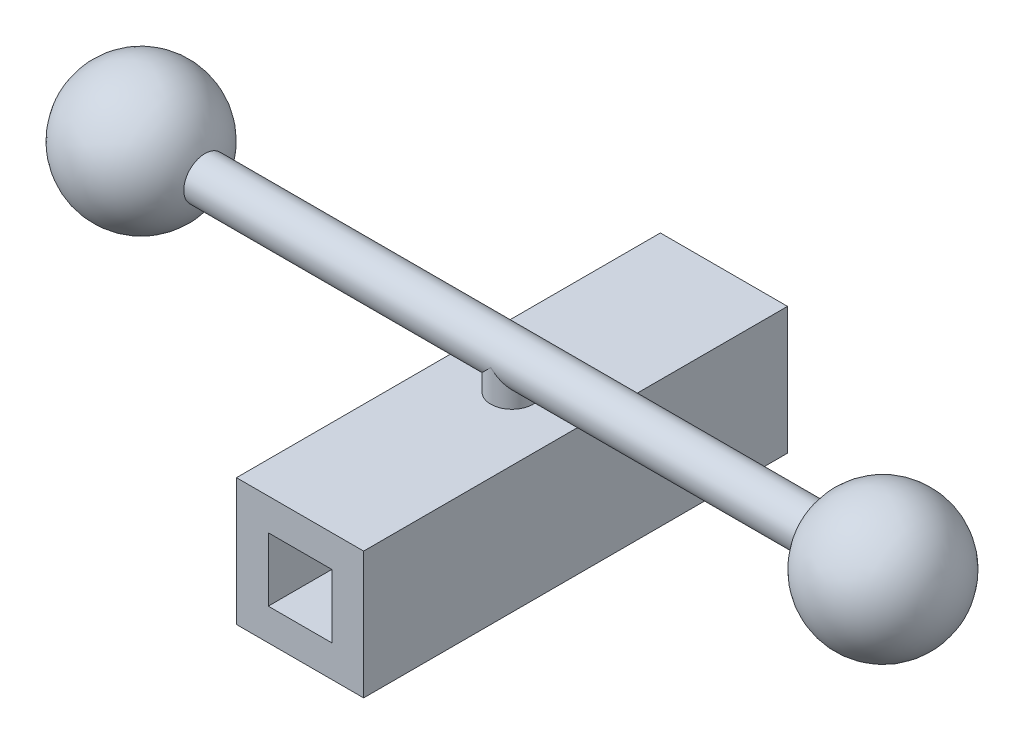
ISO-10303-21;
HEADER;
FILE_DESCRIPTION(('STEP AP214'),'2;1');
FILE_NAME('part.step','',(''),(''),'','','');
FILE_SCHEMA(('AUTOMOTIVE_DESIGN { 1 0 10303 214 1 1 1 1 }'));
ENDSEC;
DATA;
#1=APPLICATION_CONTEXT('core data for automotive mechanical design processes');
#2=APPLICATION_PROTOCOL_DEFINITION('international standard','automotive_design',2000,#1);
#3=PRODUCT_CONTEXT('',#1,'mechanical');
#4=PRODUCT('Part','Part','',(#3));
#5=PRODUCT_RELATED_PRODUCT_CATEGORY('part','',(#4));
#6=PRODUCT_DEFINITION_FORMATION('','',#4);
#7=PRODUCT_DEFINITION_CONTEXT('part definition',#1,'design');
#8=PRODUCT_DEFINITION('design','',#6,#7);
#9=PRODUCT_DEFINITION_SHAPE('','',#8);
#10=(LENGTH_UNIT() NAMED_UNIT(*) SI_UNIT(.MILLI.,.METRE.));
#11=(NAMED_UNIT(*) PLANE_ANGLE_UNIT() SI_UNIT($,.RADIAN.));
#12=(NAMED_UNIT(*) SI_UNIT($,.STERADIAN.) SOLID_ANGLE_UNIT());
#13=UNCERTAINTY_MEASURE_WITH_UNIT(LENGTH_MEASURE(1.E-05),#10,'distance_accuracy_value','');
#14=(GEOMETRIC_REPRESENTATION_CONTEXT(3) GLOBAL_UNCERTAINTY_ASSIGNED_CONTEXT((#13)) GLOBAL_UNIT_ASSIGNED_CONTEXT((#10,
#11,#12)) REPRESENTATION_CONTEXT('',''));
#15=CARTESIAN_POINT('',(0.,0.,0.));
#16=DIRECTION('',(0.,0.,1.));
#17=DIRECTION('',(1.,0.,0.));
#18=AXIS2_PLACEMENT_3D('',#15,#16,#17);
#19=CARTESIAN_POINT('',(0.,14.6568542494924,0.));
#20=DIRECTION('',(0.,-1.,0.));
#21=DIRECTION('',(0.,0.,-1.));
#22=AXIS2_PLACEMENT_3D('',#19,#20,#21);
#23=CYLINDRICAL_SURFACE('',#22,2.);
#24=CARTESIAN_POINT('',(0.,6.,0.));
#25=DIRECTION('',(0.,-1.,0.));
#26=DIRECTION('',(0.,0.,-1.));
#27=AXIS2_PLACEMENT_3D('',#24,#25,#26);
#28=CIRCLE('',#27,2.);
#29=CARTESIAN_POINT('',(0.,6.,-2.));
#30=VERTEX_POINT('',#29);
#31=EDGE_CURVE('E112',#30,#30,#28,.F.);
#32=ORIENTED_EDGE('',*,*,#31,.T.);
#33=EDGE_LOOP('',(#32));
#34=FACE_BOUND('',#33,.T.);
#35=CARTESIAN_POINT('',(0.,9.,0.));
#36=DIRECTION('',(-0.707106781186547,-0.707106781186547,0.));
#37=DIRECTION('',(0.707106781186547,-0.707106781186547,0.));
#38=AXIS2_PLACEMENT_3D('',#35,#36,#37);
#39=ELLIPSE('',#38,2.82842712474619,2.);
#40=CARTESIAN_POINT('',(0.,9.,2.));
#41=VERTEX_POINT('',#40);
#42=CARTESIAN_POINT('',(0.,9.,-2.));
#43=VERTEX_POINT('',#42);
#44=EDGE_CURVE('E45',#41,#43,#39,.F.);
#45=ORIENTED_EDGE('',*,*,#44,.F.);
#46=CARTESIAN_POINT('',(0.,9.,0.));
#47=DIRECTION('',(-0.707106781186548,0.707106781186548,0.));
#48=DIRECTION('',(-0.707106781186548,-0.707106781186548,0.));
#49=AXIS2_PLACEMENT_3D('',#46,#47,#48);
#50=ELLIPSE('',#49,2.82842712474619,2.);
#51=EDGE_CURVE('E104',#43,#41,#50,.T.);
#52=ORIENTED_EDGE('',*,*,#51,.F.);
#53=EDGE_LOOP('',(#45,#52));
#54=FACE_BOUND('',#53,.T.);
#55=ADVANCED_FACE('F37',(#34,#54),#23,.T.);
#56=CARTESIAN_POINT('',(-6.,6.,20.));
#57=DIRECTION('',(0.,-1.,0.));
#58=DIRECTION('',(0.,0.,-1.));
#59=AXIS2_PLACEMENT_3D('',#56,#57,#58);
#60=PLANE('',#59);
#61=DIRECTION('',(-1.,0.,0.));
#62=VECTOR('',#61,1.);
#63=CARTESIAN_POINT('',(-6.,6.,-20.));
#64=LINE('',#63,#62);
#65=CARTESIAN_POINT('',(6.,6.,-20.));
#66=VERTEX_POINT('',#65);
#67=CARTESIAN_POINT('',(-6.,6.,-20.));
#68=VERTEX_POINT('',#67);
#69=EDGE_CURVE('E130',#66,#68,#64,.T.);
#70=ORIENTED_EDGE('',*,*,#69,.T.);
#71=DIRECTION('',(0.,0.,-1.));
#72=VECTOR('',#71,1.);
#73=CARTESIAN_POINT('',(-6.,6.,20.));
#74=LINE('',#73,#72);
#75=CARTESIAN_POINT('',(-6.,6.,20.));
#76=VERTEX_POINT('',#75);
#77=EDGE_CURVE('E126',#76,#68,#74,.T.);
#78=ORIENTED_EDGE('',*,*,#77,.F.);
#79=DIRECTION('',(-1.,0.,0.));
#80=VECTOR('',#79,1.);
#81=CARTESIAN_POINT('',(-6.,6.,20.));
#82=LINE('',#81,#80);
#83=CARTESIAN_POINT('',(6.,6.,20.));
#84=VERTEX_POINT('',#83);
#85=EDGE_CURVE('E129',#84,#76,#82,.T.);
#86=ORIENTED_EDGE('',*,*,#85,.F.);
#87=DIRECTION('',(0.,0.,-1.));
#88=VECTOR('',#87,1.);
#89=CARTESIAN_POINT('',(6.,6.,20.));
#90=LINE('',#89,#88);
#91=EDGE_CURVE('E123',#84,#66,#90,.T.);
#92=ORIENTED_EDGE('',*,*,#91,.T.);
#93=EDGE_LOOP('',(#70,#78,#86,#92));
#94=FACE_BOUND('',#93,.T.);
#95=ORIENTED_EDGE('',*,*,#31,.F.);
#96=EDGE_LOOP('',(#95));
#97=FACE_BOUND('',#96,.T.);
#98=ADVANCED_FACE('F204',(#94,#97),#60,.F.);
#99=CARTESIAN_POINT('',(0.,0.,20.));
#100=DIRECTION('',(0.,0.,1.));
#101=DIRECTION('',(1.,0.,0.));
#102=AXIS2_PLACEMENT_3D('',#99,#100,#101);
#103=PLANE('',#102);
#104=DIRECTION('',(0.,-1.,0.));
#105=VECTOR('',#104,1.);
#106=CARTESIAN_POINT('',(-6.,6.,20.));
#107=LINE('',#106,#105);
#108=CARTESIAN_POINT('',(-6.,-6.,20.));
#109=VERTEX_POINT('',#108);
#110=EDGE_CURVE('E132',#76,#109,#107,.T.);
#111=ORIENTED_EDGE('',*,*,#110,.T.);
#112=DIRECTION('',(1.,0.,0.));
#113=VECTOR('',#112,1.);
#114=CARTESIAN_POINT('',(-6.,-6.,20.));
#115=LINE('',#114,#113);
#116=CARTESIAN_POINT('',(6.,-6.,20.));
#117=VERTEX_POINT('',#116);
#118=EDGE_CURVE('E144',#109,#117,#115,.T.);
#119=ORIENTED_EDGE('',*,*,#118,.T.);
#120=DIRECTION('',(0.,1.,0.));
#121=VECTOR('',#120,1.);
#122=CARTESIAN_POINT('',(6.,6.,20.));
#123=LINE('',#122,#121);
#124=EDGE_CURVE('E142',#117,#84,#123,.T.);
#125=ORIENTED_EDGE('',*,*,#124,.T.);
#126=ORIENTED_EDGE('',*,*,#85,.T.);
#127=EDGE_LOOP('',(#111,#119,#125,#126));
#128=FACE_BOUND('',#127,.T.);
#129=DIRECTION('',(1.,0.,0.));
#130=VECTOR('',#129,1.);
#131=CARTESIAN_POINT('',(-3.,-3.,20.));
#132=LINE('',#131,#130);
#133=CARTESIAN_POINT('',(-3.,-3.,20.));
#134=VERTEX_POINT('',#133);
#135=CARTESIAN_POINT('',(3.,-3.,20.));
#136=VERTEX_POINT('',#135);
#137=EDGE_CURVE('E172',#134,#136,#132,.T.);
#138=ORIENTED_EDGE('',*,*,#137,.F.);
#139=DIRECTION('',(0.,-1.,0.));
#140=VECTOR('',#139,1.);
#141=CARTESIAN_POINT('',(-3.,3.,20.));
#142=LINE('',#141,#140);
#143=CARTESIAN_POINT('',(-3.,3.,20.));
#144=VERTEX_POINT('',#143);
#145=EDGE_CURVE('E160',#144,#134,#142,.T.);
#146=ORIENTED_EDGE('',*,*,#145,.F.);
#147=DIRECTION('',(-1.,0.,0.));
#148=VECTOR('',#147,1.);
#149=CARTESIAN_POINT('',(-3.,3.,20.));
#150=LINE('',#149,#148);
#151=CARTESIAN_POINT('',(3.,3.,20.));
#152=VERTEX_POINT('',#151);
#153=EDGE_CURVE('E156',#152,#144,#150,.T.);
#154=ORIENTED_EDGE('',*,*,#153,.F.);
#155=DIRECTION('',(0.,1.,0.));
#156=VECTOR('',#155,1.);
#157=CARTESIAN_POINT('',(3.,3.,20.));
#158=LINE('',#157,#156);
#159=EDGE_CURVE('E170',#136,#152,#158,.T.);
#160=ORIENTED_EDGE('',*,*,#159,.F.);
#161=EDGE_LOOP('',(#138,#146,#154,#160));
#162=FACE_BOUND('',#161,.T.);
#163=ADVANCED_FACE('F186',(#128,#162),#103,.T.);
#164=CARTESIAN_POINT('',(0.,0.,-20.));
#165=DIRECTION('',(0.,0.,1.));
#166=DIRECTION('',(1.,0.,0.));
#167=AXIS2_PLACEMENT_3D('',#164,#165,#166);
#168=PLANE('',#167);
#169=DIRECTION('',(0.,-1.,0.));
#170=VECTOR('',#169,1.);
#171=CARTESIAN_POINT('',(-6.,6.,-20.));
#172=LINE('',#171,#170);
#173=CARTESIAN_POINT('',(-6.,-6.,-20.));
#174=VERTEX_POINT('',#173);
#175=EDGE_CURVE('E137',#68,#174,#172,.T.);
#176=ORIENTED_EDGE('',*,*,#175,.F.);
#177=ORIENTED_EDGE('',*,*,#69,.F.);
#178=DIRECTION('',(0.,1.,0.));
#179=VECTOR('',#178,1.);
#180=CARTESIAN_POINT('',(6.,6.,-20.));
#181=LINE('',#180,#179);
#182=CARTESIAN_POINT('',(6.,-6.,-20.));
#183=VERTEX_POINT('',#182);
#184=EDGE_CURVE('E133',#183,#66,#181,.T.);
#185=ORIENTED_EDGE('',*,*,#184,.F.);
#186=DIRECTION('',(1.,0.,0.));
#187=VECTOR('',#186,1.);
#188=CARTESIAN_POINT('',(-6.,-6.,-20.));
#189=LINE('',#188,#187);
#190=EDGE_CURVE('E135',#174,#183,#189,.T.);
#191=ORIENTED_EDGE('',*,*,#190,.F.);
#192=EDGE_LOOP('',(#176,#177,#185,#191));
#193=FACE_BOUND('',#192,.T.);
#194=DIRECTION('',(0.,-1.,0.));
#195=VECTOR('',#194,1.);
#196=CARTESIAN_POINT('',(-3.,3.,-20.));
#197=LINE('',#196,#195);
#198=CARTESIAN_POINT('',(-3.,3.,-20.));
#199=VERTEX_POINT('',#198);
#200=CARTESIAN_POINT('',(-3.,-3.,-20.));
#201=VERTEX_POINT('',#200);
#202=EDGE_CURVE('E106',#199,#201,#197,.T.);
#203=ORIENTED_EDGE('',*,*,#202,.T.);
#204=DIRECTION('',(1.,0.,0.));
#205=VECTOR('',#204,1.);
#206=CARTESIAN_POINT('',(-3.,-3.,-20.));
#207=LINE('',#206,#205);
#208=CARTESIAN_POINT('',(3.,-3.,-20.));
#209=VERTEX_POINT('',#208);
#210=EDGE_CURVE('E164',#201,#209,#207,.T.);
#211=ORIENTED_EDGE('',*,*,#210,.T.);
#212=DIRECTION('',(0.,1.,0.));
#213=VECTOR('',#212,1.);
#214=CARTESIAN_POINT('',(3.,3.,-20.));
#215=LINE('',#214,#213);
#216=CARTESIAN_POINT('',(3.,3.,-20.));
#217=VERTEX_POINT('',#216);
#218=EDGE_CURVE('E161',#209,#217,#215,.T.);
#219=ORIENTED_EDGE('',*,*,#218,.T.);
#220=DIRECTION('',(-1.,0.,0.));
#221=VECTOR('',#220,1.);
#222=CARTESIAN_POINT('',(-3.,3.,-20.));
#223=LINE('',#222,#221);
#224=EDGE_CURVE('E157',#217,#199,#223,.T.);
#225=ORIENTED_EDGE('',*,*,#224,.T.);
#226=EDGE_LOOP('',(#203,#211,#219,#225));
#227=FACE_BOUND('',#226,.T.);
#228=ADVANCED_FACE('F191',(#193,#227),#168,.F.);
#229=CARTESIAN_POINT('',(-6.,6.,20.));
#230=DIRECTION('',(1.,0.,0.));
#231=DIRECTION('',(0.,1.,0.));
#232=AXIS2_PLACEMENT_3D('',#229,#230,#231);
#233=PLANE('',#232);
#234=ORIENTED_EDGE('',*,*,#175,.T.);
#235=DIRECTION('',(0.,0.,-1.));
#236=VECTOR('',#235,1.);
#237=CARTESIAN_POINT('',(-6.,-6.,20.));
#238=LINE('',#237,#236);
#239=EDGE_CURVE('E117',#109,#174,#238,.T.);
#240=ORIENTED_EDGE('',*,*,#239,.F.);
#241=ORIENTED_EDGE('',*,*,#110,.F.);
#242=ORIENTED_EDGE('',*,*,#77,.T.);
#243=EDGE_LOOP('',(#234,#240,#241,#242));
#244=FACE_BOUND('',#243,.T.);
#245=ADVANCED_FACE('F39',(#244),#233,.F.);
#246=CARTESIAN_POINT('',(-6.,-6.,20.));
#247=DIRECTION('',(0.,1.,0.));
#248=DIRECTION('',(0.,0.,1.));
#249=AXIS2_PLACEMENT_3D('',#246,#247,#248);
#250=PLANE('',#249);
#251=ORIENTED_EDGE('',*,*,#190,.T.);
#252=DIRECTION('',(0.,0.,-1.));
#253=VECTOR('',#252,1.);
#254=CARTESIAN_POINT('',(6.,-6.,20.));
#255=LINE('',#254,#253);
#256=EDGE_CURVE('E120',#117,#183,#255,.T.);
#257=ORIENTED_EDGE('',*,*,#256,.F.);
#258=ORIENTED_EDGE('',*,*,#118,.F.);
#259=ORIENTED_EDGE('',*,*,#239,.T.);
#260=EDGE_LOOP('',(#251,#257,#258,#259));
#261=FACE_BOUND('',#260,.T.);
#262=ADVANCED_FACE('F278',(#261),#250,.F.);
#263=CARTESIAN_POINT('',(6.,6.,20.));
#264=DIRECTION('',(-1.,0.,0.));
#265=DIRECTION('',(0.,-1.,0.));
#266=AXIS2_PLACEMENT_3D('',#263,#264,#265);
#267=PLANE('',#266);
#268=ORIENTED_EDGE('',*,*,#184,.T.);
#269=ORIENTED_EDGE('',*,*,#91,.F.);
#270=ORIENTED_EDGE('',*,*,#124,.F.);
#271=ORIENTED_EDGE('',*,*,#256,.T.);
#272=EDGE_LOOP('',(#268,#269,#270,#271));
#273=FACE_BOUND('',#272,.T.);
#274=ADVANCED_FACE('F270',(#273),#267,.F.);
#275=CARTESIAN_POINT('',(-3.,3.,20.));
#276=DIRECTION('',(1.,0.,0.));
#277=DIRECTION('',(0.,0.,-1.));
#278=AXIS2_PLACEMENT_3D('',#275,#276,#277);
#279=PLANE('',#278);
#280=ORIENTED_EDGE('',*,*,#202,.F.);
#281=DIRECTION('',(0.,0.,-1.));
#282=VECTOR('',#281,1.);
#283=CARTESIAN_POINT('',(-3.,3.,20.));
#284=LINE('',#283,#282);
#285=EDGE_CURVE('E153',#144,#199,#284,.T.);
#286=ORIENTED_EDGE('',*,*,#285,.F.);
#287=ORIENTED_EDGE('',*,*,#145,.T.);
#288=DIRECTION('',(0.,0.,-1.));
#289=VECTOR('',#288,1.);
#290=CARTESIAN_POINT('',(-3.,-3.,20.));
#291=LINE('',#290,#289);
#292=EDGE_CURVE('E140',#134,#201,#291,.T.);
#293=ORIENTED_EDGE('',*,*,#292,.T.);
#294=EDGE_LOOP('',(#280,#286,#287,#293));
#295=FACE_BOUND('',#294,.T.);
#296=ADVANCED_FACE('F178',(#295),#279,.T.);
#297=CARTESIAN_POINT('',(-3.,-3.,20.));
#298=DIRECTION('',(0.,1.,0.));
#299=DIRECTION('',(0.,0.,1.));
#300=AXIS2_PLACEMENT_3D('',#297,#298,#299);
#301=PLANE('',#300);
#302=ORIENTED_EDGE('',*,*,#210,.F.);
#303=ORIENTED_EDGE('',*,*,#292,.F.);
#304=ORIENTED_EDGE('',*,*,#137,.T.);
#305=DIRECTION('',(0.,0.,-1.));
#306=VECTOR('',#305,1.);
#307=CARTESIAN_POINT('',(3.,-3.,20.));
#308=LINE('',#307,#306);
#309=EDGE_CURVE('E150',#136,#209,#308,.T.);
#310=ORIENTED_EDGE('',*,*,#309,.T.);
#311=EDGE_LOOP('',(#302,#303,#304,#310));
#312=FACE_BOUND('',#311,.T.);
#313=ADVANCED_FACE('F183',(#312),#301,.T.);
#314=CARTESIAN_POINT('',(3.,3.,20.));
#315=DIRECTION('',(-1.,0.,0.));
#316=DIRECTION('',(0.,0.,1.));
#317=AXIS2_PLACEMENT_3D('',#314,#315,#316);
#318=PLANE('',#317);
#319=ORIENTED_EDGE('',*,*,#218,.F.);
#320=ORIENTED_EDGE('',*,*,#309,.F.);
#321=ORIENTED_EDGE('',*,*,#159,.T.);
#322=DIRECTION('',(0.,0.,-1.));
#323=VECTOR('',#322,1.);
#324=CARTESIAN_POINT('',(3.,3.,20.));
#325=LINE('',#324,#323);
#326=EDGE_CURVE('E58',#152,#217,#325,.T.);
#327=ORIENTED_EDGE('',*,*,#326,.T.);
#328=EDGE_LOOP('',(#319,#320,#321,#327));
#329=FACE_BOUND('',#328,.T.);
#330=ADVANCED_FACE('F189',(#329),#318,.T.);
#331=CARTESIAN_POINT('',(-3.,3.,20.));
#332=DIRECTION('',(0.,-1.,0.));
#333=DIRECTION('',(0.,0.,-1.));
#334=AXIS2_PLACEMENT_3D('',#331,#332,#333);
#335=PLANE('',#334);
#336=ORIENTED_EDGE('',*,*,#224,.F.);
#337=ORIENTED_EDGE('',*,*,#326,.F.);
#338=ORIENTED_EDGE('',*,*,#153,.T.);
#339=ORIENTED_EDGE('',*,*,#285,.T.);
#340=EDGE_LOOP('',(#336,#337,#338,#339));
#341=FACE_BOUND('',#340,.T.);
#342=ADVANCED_FACE('F192',(#341),#335,.T.);
#343=CARTESIAN_POINT('',(0.,9.,0.));
#344=DIRECTION('',(-1.,0.,0.));
#345=DIRECTION('',(0.,0.,1.));
#346=AXIS2_PLACEMENT_3D('',#343,#344,#345);
#347=CYLINDRICAL_SURFACE('',#346,2.);
#348=CARTESIAN_POINT('',(28.9731849207065,9.,0.));
#349=DIRECTION('',(1.,0.,0.));
#350=DIRECTION('',(0.,0.,-1.));
#351=AXIS2_PLACEMENT_3D('',#348,#349,#350);
#352=CIRCLE('',#351,2.);
#353=CARTESIAN_POINT('',(28.9731849207065,9.,-2.));
#354=VERTEX_POINT('',#353);
#355=EDGE_CURVE('E12',#354,#354,#352,.T.);
#356=ORIENTED_EDGE('',*,*,#355,.F.);
#357=EDGE_LOOP('',(#356));
#358=FACE_BOUND('',#357,.T.);
#359=ORIENTED_EDGE('',*,*,#51,.T.);
#360=ORIENTED_EDGE('',*,*,#44,.T.);
#361=EDGE_LOOP('',(#359,#360));
#362=FACE_BOUND('',#361,.T.);
#363=CARTESIAN_POINT('',(-28.9731849207065,9.,0.));
#364=DIRECTION('',(-1.,0.,0.));
#365=DIRECTION('',(0.,0.,1.));
#366=AXIS2_PLACEMENT_3D('',#363,#364,#365);
#367=CIRCLE('',#366,2.);
#368=CARTESIAN_POINT('',(-28.9731849207065,9.,2.));
#369=VERTEX_POINT('',#368);
#370=EDGE_CURVE('E110',#369,#369,#367,.T.);
#371=ORIENTED_EDGE('',*,*,#370,.F.);
#372=EDGE_LOOP('',(#371));
#373=FACE_BOUND('',#372,.T.);
#374=ADVANCED_FACE('F108',(#358,#362,#373),#347,.T.);
#375=CARTESIAN_POINT('',(-35.,9.,0.));
#376=DIRECTION('',(0.,1.,0.));
#377=DIRECTION('',(1.,0.,0.));
#378=AXIS2_PLACEMENT_3D('',#375,#376,#377);
#379=SPHERICAL_SURFACE('',#378,6.35);
#380=CARTESIAN_POINT('',(-35.,9.,0.));
#381=DIRECTION('',(-1.,0.,0.));
#382=DIRECTION('',(0.,0.,1.));
#383=AXIS2_PLACEMENT_3D('',#380,#381,#382);
#384=SPHERICAL_SURFACE('',#383,6.35);
#385=ORIENTED_EDGE('',*,*,#370,.T.);
#386=EDGE_LOOP('',(#385));
#387=FACE_BOUND('',#386,.T.);
#388=ADVANCED_FACE('F199',(#387),#384,.T.);
#389=CARTESIAN_POINT('',(35.,9.,0.));
#390=DIRECTION('',(0.,1.,0.));
#391=DIRECTION('',(-1.,0.,0.));
#392=AXIS2_PLACEMENT_3D('',#389,#390,#391);
#393=SPHERICAL_SURFACE('',#392,6.35);
#394=CARTESIAN_POINT('',(35.,9.,0.));
#395=DIRECTION('',(1.,0.,0.));
#396=DIRECTION('',(0.,0.,-1.));
#397=AXIS2_PLACEMENT_3D('',#394,#395,#396);
#398=SPHERICAL_SURFACE('',#397,6.35);
#399=ORIENTED_EDGE('',*,*,#355,.T.);
#400=EDGE_LOOP('',(#399));
#401=FACE_BOUND('',#400,.T.);
#402=ADVANCED_FACE('F215',(#401),#398,.T.);
#403=CLOSED_SHELL('',(#55,#98,#163,#228,#245,#262,#274,#296,#313,#330,#342,#374,#388,#402));
#404=MANIFOLD_SOLID_BREP('B2',#403);
#405=ADVANCED_BREP_SHAPE_REPRESENTATION('',(#18,#404),#14);
#406=SHAPE_DEFINITION_REPRESENTATION(#9,#405);
ENDSEC;
END-ISO-10303-21;
